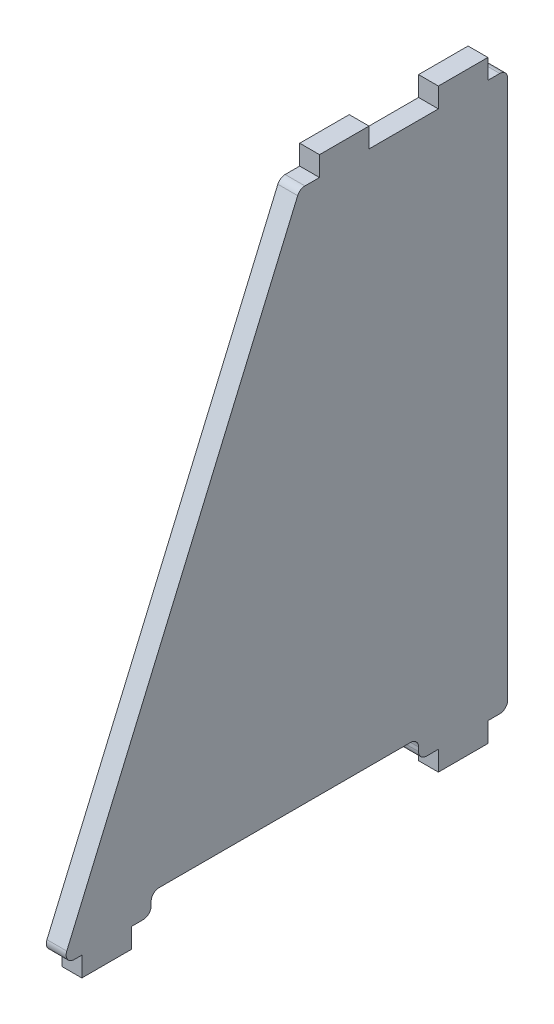
ISO-10303-21;
HEADER;
FILE_DESCRIPTION(('STEP AP214'),'2;1');
FILE_NAME('part.step','',(''),(''),'','','');
FILE_SCHEMA(('AUTOMOTIVE_DESIGN { 1 0 10303 214 1 1 1 1 }'));
ENDSEC;
DATA;
#1=APPLICATION_CONTEXT('core data for automotive mechanical design processes');
#2=APPLICATION_PROTOCOL_DEFINITION('international standard','automotive_design',2000,#1);
#3=PRODUCT_CONTEXT('',#1,'mechanical');
#4=PRODUCT('Part','Part','',(#3));
#5=PRODUCT_RELATED_PRODUCT_CATEGORY('part','',(#4));
#6=PRODUCT_DEFINITION_FORMATION('','',#4);
#7=PRODUCT_DEFINITION_CONTEXT('part definition',#1,'design');
#8=PRODUCT_DEFINITION('design','',#6,#7);
#9=PRODUCT_DEFINITION_SHAPE('','',#8);
#10=(LENGTH_UNIT() NAMED_UNIT(*) SI_UNIT(.MILLI.,.METRE.));
#11=(NAMED_UNIT(*) PLANE_ANGLE_UNIT() SI_UNIT($,.RADIAN.));
#12=(NAMED_UNIT(*) SI_UNIT($,.STERADIAN.) SOLID_ANGLE_UNIT());
#13=UNCERTAINTY_MEASURE_WITH_UNIT(LENGTH_MEASURE(1.E-05),#10,'distance_accuracy_value','');
#14=(GEOMETRIC_REPRESENTATION_CONTEXT(3) GLOBAL_UNCERTAINTY_ASSIGNED_CONTEXT((#13)) GLOBAL_UNIT_ASSIGNED_CONTEXT((#10,
#11,#12)) REPRESENTATION_CONTEXT('',''));
#15=CARTESIAN_POINT('',(0.,0.,0.));
#16=DIRECTION('',(0.,0.,1.));
#17=DIRECTION('',(1.,0.,0.));
#18=AXIS2_PLACEMENT_3D('',#15,#16,#17);
#19=CARTESIAN_POINT('',(6.35,0.,-4.76250000000001));
#20=DIRECTION('',(0.,0.,-1.));
#21=DIRECTION('',(0.,1.,0.));
#22=AXIS2_PLACEMENT_3D('',#19,#20,#21);
#23=PLANE('',#22);
#24=DIRECTION('',(0.,-1.,0.));
#25=VECTOR('',#24,1.);
#26=CARTESIAN_POINT('',(0.,0.,-4.76250000000001));
#27=LINE('',#26,#25);
#28=CARTESIAN_POINT('',(0.,-85.09,-4.76250000000002));
#29=VERTEX_POINT('',#28);
#30=CARTESIAN_POINT('',(0.,-86.36,-4.76250000000002));
#31=VERTEX_POINT('',#30);
#32=EDGE_CURVE('E420',#29,#31,#27,.T.);
#33=ORIENTED_EDGE('',*,*,#32,.T.);
#34=DIRECTION('',(-1.,0.,0.));
#35=VECTOR('',#34,1.);
#36=CARTESIAN_POINT('',(6.35,-86.36,-4.76250000000002));
#37=LINE('',#36,#35);
#38=CARTESIAN_POINT('',(6.35,-86.36,-4.76250000000002));
#39=VERTEX_POINT('',#38);
#40=EDGE_CURVE('E620',#31,#39,#37,.F.);
#41=ORIENTED_EDGE('',*,*,#40,.T.);
#42=DIRECTION('',(0.,-1.,0.));
#43=VECTOR('',#42,1.);
#44=CARTESIAN_POINT('',(6.35,0.,-4.76250000000001));
#45=LINE('',#44,#43);
#46=CARTESIAN_POINT('',(6.35,-85.09,-4.76250000000002));
#47=VERTEX_POINT('',#46);
#48=EDGE_CURVE('E344',#47,#39,#45,.T.);
#49=ORIENTED_EDGE('',*,*,#48,.F.);
#50=DIRECTION('',(-1.,0.,0.));
#51=VECTOR('',#50,1.);
#52=CARTESIAN_POINT('',(0.,-85.09,-4.76250000000002));
#53=LINE('',#52,#51);
#54=EDGE_CURVE('E616',#47,#29,#53,.T.);
#55=ORIENTED_EDGE('',*,*,#54,.T.);
#56=EDGE_LOOP('',(#33,#41,#49,#55));
#57=FACE_BOUND('',#56,.T.);
#58=ADVANCED_FACE('F121',(#57),#23,.F.);
#59=CARTESIAN_POINT('',(6.35,-88.9,0.));
#60=DIRECTION('',(0.,1.,0.));
#61=DIRECTION('',(0.,0.,1.));
#62=AXIS2_PLACEMENT_3D('',#59,#60,#61);
#63=PLANE('',#62);
#64=DIRECTION('',(0.,0.,-1.));
#65=VECTOR('',#64,1.);
#66=CARTESIAN_POINT('',(6.35,-88.9,0.));
#67=LINE('',#66,#65);
#68=CARTESIAN_POINT('',(6.35,-88.9,-7.30250000000002));
#69=VERTEX_POINT('',#68);
#70=CARTESIAN_POINT('',(6.35,-88.9,-11.1125));
#71=VERTEX_POINT('',#70);
#72=EDGE_CURVE('E330',#69,#71,#67,.T.);
#73=ORIENTED_EDGE('',*,*,#72,.F.);
#74=DIRECTION('',(-1.,0.,0.));
#75=VECTOR('',#74,1.);
#76=CARTESIAN_POINT('',(6.35,-88.9,-7.30250000000002));
#77=LINE('',#76,#75);
#78=CARTESIAN_POINT('',(0.,-88.9,-7.30250000000002));
#79=VERTEX_POINT('',#78);
#80=EDGE_CURVE('E613',#69,#79,#77,.T.);
#81=ORIENTED_EDGE('',*,*,#80,.T.);
#82=DIRECTION('',(0.,0.,-1.));
#83=VECTOR('',#82,1.);
#84=CARTESIAN_POINT('',(0.,-88.9,0.));
#85=LINE('',#84,#83);
#86=CARTESIAN_POINT('',(0.,-88.9,-11.1125));
#87=VERTEX_POINT('',#86);
#88=EDGE_CURVE('E351',#79,#87,#85,.T.);
#89=ORIENTED_EDGE('',*,*,#88,.T.);
#90=DIRECTION('',(-1.,0.,0.));
#91=VECTOR('',#90,1.);
#92=CARTESIAN_POINT('',(6.35,-88.9,-11.1125));
#93=LINE('',#92,#91);
#94=EDGE_CURVE('E348',#71,#87,#93,.T.);
#95=ORIENTED_EDGE('',*,*,#94,.F.);
#96=EDGE_LOOP('',(#73,#81,#89,#95));
#97=FACE_BOUND('',#96,.T.);
#98=ADVANCED_FACE('F349',(#97),#63,.F.);
#99=CARTESIAN_POINT('',(6.35,0.,-11.1125));
#100=DIRECTION('',(0.,0.,-1.));
#101=DIRECTION('',(0.,1.,0.));
#102=AXIS2_PLACEMENT_3D('',#99,#100,#101);
#103=PLANE('',#102);
#104=DIRECTION('',(0.,-1.,0.));
#105=VECTOR('',#104,1.);
#106=CARTESIAN_POINT('',(0.,0.,-11.1125));
#107=LINE('',#106,#105);
#108=CARTESIAN_POINT('',(0.,-95.25,-11.1125));
#109=VERTEX_POINT('',#108);
#110=EDGE_CURVE('E427',#87,#109,#107,.T.);
#111=ORIENTED_EDGE('',*,*,#110,.T.);
#112=DIRECTION('',(-1.,0.,0.));
#113=VECTOR('',#112,1.);
#114=CARTESIAN_POINT('',(6.35,-95.25,-11.1125));
#115=LINE('',#114,#113);
#116=CARTESIAN_POINT('',(6.35,-95.25,-11.1125));
#117=VERTEX_POINT('',#116);
#118=EDGE_CURVE('E356',#117,#109,#115,.T.);
#119=ORIENTED_EDGE('',*,*,#118,.F.);
#120=DIRECTION('',(0.,-1.,0.));
#121=VECTOR('',#120,1.);
#122=CARTESIAN_POINT('',(6.35,0.,-11.1125));
#123=LINE('',#122,#121);
#124=EDGE_CURVE('E335',#71,#117,#123,.T.);
#125=ORIENTED_EDGE('',*,*,#124,.F.);
#126=ORIENTED_EDGE('',*,*,#94,.T.);
#127=EDGE_LOOP('',(#111,#119,#125,#126));
#128=FACE_BOUND('',#127,.T.);
#129=ADVANCED_FACE('F358',(#128),#103,.F.);
#130=CARTESIAN_POINT('',(6.35,-95.25,0.));
#131=DIRECTION('',(0.,1.,0.));
#132=DIRECTION('',(0.,0.,1.));
#133=AXIS2_PLACEMENT_3D('',#130,#131,#132);
#134=PLANE('',#133);
#135=DIRECTION('',(0.,0.,-1.));
#136=VECTOR('',#135,1.);
#137=CARTESIAN_POINT('',(0.,-95.25,0.));
#138=LINE('',#137,#136);
#139=CARTESIAN_POINT('',(0.,-95.25,-26.9875));
#140=VERTEX_POINT('',#139);
#141=EDGE_CURVE('E431',#109,#140,#138,.T.);
#142=ORIENTED_EDGE('',*,*,#141,.T.);
#143=DIRECTION('',(-1.,0.,0.));
#144=VECTOR('',#143,1.);
#145=CARTESIAN_POINT('',(6.35,-95.25,-26.9875));
#146=LINE('',#145,#144);
#147=CARTESIAN_POINT('',(6.35,-95.25,-26.9875));
#148=VERTEX_POINT('',#147);
#149=EDGE_CURVE('E513',#148,#140,#146,.T.);
#150=ORIENTED_EDGE('',*,*,#149,.F.);
#151=DIRECTION('',(0.,0.,-1.));
#152=VECTOR('',#151,1.);
#153=CARTESIAN_POINT('',(6.35,-95.25,0.));
#154=LINE('',#153,#152);
#155=EDGE_CURVE('E362',#117,#148,#154,.T.);
#156=ORIENTED_EDGE('',*,*,#155,.F.);
#157=ORIENTED_EDGE('',*,*,#118,.T.);
#158=EDGE_LOOP('',(#142,#150,#156,#157));
#159=FACE_BOUND('',#158,.T.);
#160=ADVANCED_FACE('F672',(#159),#134,.F.);
#161=CARTESIAN_POINT('',(6.35,0.,-26.9875));
#162=DIRECTION('',(0.,0.,-1.));
#163=DIRECTION('',(0.,1.,0.));
#164=AXIS2_PLACEMENT_3D('',#161,#162,#163);
#165=PLANE('',#164);
#166=DIRECTION('',(0.,-1.,0.));
#167=VECTOR('',#166,1.);
#168=CARTESIAN_POINT('',(0.,0.,-26.9875));
#169=LINE('',#168,#167);
#170=CARTESIAN_POINT('',(0.,-88.9,-26.9875));
#171=VERTEX_POINT('',#170);
#172=EDGE_CURVE('E435',#171,#140,#169,.T.);
#173=ORIENTED_EDGE('',*,*,#172,.F.);
#174=DIRECTION('',(-1.,0.,0.));
#175=VECTOR('',#174,1.);
#176=CARTESIAN_POINT('',(6.35,-88.9,-26.9875));
#177=LINE('',#176,#175);
#178=CARTESIAN_POINT('',(6.35,-88.9,-26.9875));
#179=VERTEX_POINT('',#178);
#180=EDGE_CURVE('E510',#179,#171,#177,.T.);
#181=ORIENTED_EDGE('',*,*,#180,.F.);
#182=DIRECTION('',(0.,-1.,0.));
#183=VECTOR('',#182,1.);
#184=CARTESIAN_POINT('',(6.35,0.,-26.9875));
#185=LINE('',#184,#183);
#186=EDGE_CURVE('E365',#179,#148,#185,.T.);
#187=ORIENTED_EDGE('',*,*,#186,.T.);
#188=ORIENTED_EDGE('',*,*,#149,.T.);
#189=EDGE_LOOP('',(#173,#181,#187,#188));
#190=FACE_BOUND('',#189,.T.);
#191=ADVANCED_FACE('F680',(#190),#165,.T.);
#192=CARTESIAN_POINT('',(0.,-88.9,-30.7975));
#193=VERTEX_POINT('',#192);
#194=EDGE_CURVE('E428',#171,#193,#85,.T.);
#195=ORIENTED_EDGE('',*,*,#194,.T.);
#196=DIRECTION('',(-1.,0.,0.));
#197=VECTOR('',#196,1.);
#198=CARTESIAN_POINT('',(6.35,-88.9,-30.7975));
#199=LINE('',#198,#197);
#200=CARTESIAN_POINT('',(6.35,-88.9,-30.7975));
#201=VERTEX_POINT('',#200);
#202=EDGE_CURVE('E606',#193,#201,#199,.F.);
#203=ORIENTED_EDGE('',*,*,#202,.T.);
#204=EDGE_CURVE('E346',#179,#201,#67,.T.);
#205=ORIENTED_EDGE('',*,*,#204,.F.);
#206=ORIENTED_EDGE('',*,*,#180,.T.);
#207=EDGE_LOOP('',(#195,#203,#205,#206));
#208=FACE_BOUND('',#207,.T.);
#209=ADVANCED_FACE('F684',(#208),#63,.F.);
#210=CARTESIAN_POINT('',(6.35,0.,-33.3375));
#211=DIRECTION('',(0.,0.,-1.));
#212=DIRECTION('',(0.,1.,0.));
#213=AXIS2_PLACEMENT_3D('',#210,#211,#212);
#214=PLANE('',#213);
#215=DIRECTION('',(0.,-1.,0.));
#216=VECTOR('',#215,1.);
#217=CARTESIAN_POINT('',(0.,0.,-33.3375));
#218=LINE('',#217,#216);
#219=CARTESIAN_POINT('',(0.,86.36,-33.3375));
#220=VERTEX_POINT('',#219);
#221=CARTESIAN_POINT('',(0.,-86.36,-33.3375));
#222=VERTEX_POINT('',#221);
#223=EDGE_CURVE('E439',#220,#222,#218,.T.);
#224=ORIENTED_EDGE('',*,*,#223,.F.);
#225=DIRECTION('',(-1.,0.,0.));
#226=VECTOR('',#225,1.);
#227=CARTESIAN_POINT('',(6.35,86.36,-33.3375));
#228=LINE('',#227,#226);
#229=CARTESIAN_POINT('',(6.35,86.36,-33.3375));
#230=VERTEX_POINT('',#229);
#231=EDGE_CURVE('E603',#220,#230,#228,.F.);
#232=ORIENTED_EDGE('',*,*,#231,.T.);
#233=DIRECTION('',(0.,-1.,0.));
#234=VECTOR('',#233,1.);
#235=CARTESIAN_POINT('',(6.35,0.,-33.3375));
#236=LINE('',#235,#234);
#237=CARTESIAN_POINT('',(6.35,-86.36,-33.3375));
#238=VERTEX_POINT('',#237);
#239=EDGE_CURVE('E372',#230,#238,#236,.T.);
#240=ORIENTED_EDGE('',*,*,#239,.T.);
#241=DIRECTION('',(-1.,0.,0.));
#242=VECTOR('',#241,1.);
#243=CARTESIAN_POINT('',(0.,-86.36,-33.3375));
#244=LINE('',#243,#242);
#245=EDGE_CURVE('E599',#238,#222,#244,.T.);
#246=ORIENTED_EDGE('',*,*,#245,.T.);
#247=EDGE_LOOP('',(#224,#232,#240,#246));
#248=FACE_BOUND('',#247,.T.);
#249=ADVANCED_FACE('F750',(#248),#214,.T.);
#250=CARTESIAN_POINT('',(6.35,88.9,0.));
#251=DIRECTION('',(0.,1.,0.));
#252=DIRECTION('',(0.,0.,1.));
#253=AXIS2_PLACEMENT_3D('',#250,#251,#252);
#254=PLANE('',#253);
#255=DIRECTION('',(0.,0.,-1.));
#256=VECTOR('',#255,1.);
#257=CARTESIAN_POINT('',(6.35,88.9,0.));
#258=LINE('',#257,#256);
#259=CARTESIAN_POINT('',(6.35,88.9,-26.9875));
#260=VERTEX_POINT('',#259);
#261=CARTESIAN_POINT('',(6.35,88.9,-30.7975));
#262=VERTEX_POINT('',#261);
#263=EDGE_CURVE('E376',#260,#262,#258,.T.);
#264=ORIENTED_EDGE('',*,*,#263,.T.);
#265=DIRECTION('',(-1.,0.,0.));
#266=VECTOR('',#265,1.);
#267=CARTESIAN_POINT('',(6.35,88.9,-30.7975));
#268=LINE('',#267,#266);
#269=CARTESIAN_POINT('',(0.,88.9,-30.7975));
#270=VERTEX_POINT('',#269);
#271=EDGE_CURVE('E595',#262,#270,#268,.T.);
#272=ORIENTED_EDGE('',*,*,#271,.T.);
#273=DIRECTION('',(0.,0.,-1.));
#274=VECTOR('',#273,1.);
#275=CARTESIAN_POINT('',(0.,88.9,0.));
#276=LINE('',#275,#274);
#277=CARTESIAN_POINT('',(0.,88.9,-26.9875));
#278=VERTEX_POINT('',#277);
#279=EDGE_CURVE('E443',#278,#270,#276,.T.);
#280=ORIENTED_EDGE('',*,*,#279,.F.);
#281=DIRECTION('',(-1.,0.,0.));
#282=VECTOR('',#281,1.);
#283=CARTESIAN_POINT('',(6.35,88.9,-26.9875));
#284=LINE('',#283,#282);
#285=EDGE_CURVE('E507',#260,#278,#284,.T.);
#286=ORIENTED_EDGE('',*,*,#285,.F.);
#287=EDGE_LOOP('',(#264,#272,#280,#286));
#288=FACE_BOUND('',#287,.T.);
#289=ADVANCED_FACE('F740',(#288),#254,.T.);
#290=CARTESIAN_POINT('',(6.35,0.,-26.9875));
#291=DIRECTION('',(0.,0.,1.));
#292=DIRECTION('',(0.,-1.,0.));
#293=AXIS2_PLACEMENT_3D('',#290,#291,#292);
#294=PLANE('',#293);
#295=DIRECTION('',(0.,1.,0.));
#296=VECTOR('',#295,1.);
#297=CARTESIAN_POINT('',(0.,0.,-26.9875));
#298=LINE('',#297,#296);
#299=CARTESIAN_POINT('',(0.,95.25,-26.9875));
#300=VERTEX_POINT('',#299);
#301=EDGE_CURVE('E447',#278,#300,#298,.T.);
#302=ORIENTED_EDGE('',*,*,#301,.T.);
#303=DIRECTION('',(-1.,0.,0.));
#304=VECTOR('',#303,1.);
#305=CARTESIAN_POINT('',(6.35,95.25,-26.9875));
#306=LINE('',#305,#304);
#307=CARTESIAN_POINT('',(6.35,95.25,-26.9875));
#308=VERTEX_POINT('',#307);
#309=EDGE_CURVE('E504',#308,#300,#306,.T.);
#310=ORIENTED_EDGE('',*,*,#309,.F.);
#311=DIRECTION('',(0.,1.,0.));
#312=VECTOR('',#311,1.);
#313=CARTESIAN_POINT('',(6.35,0.,-26.9875));
#314=LINE('',#313,#312);
#315=EDGE_CURVE('E380',#260,#308,#314,.T.);
#316=ORIENTED_EDGE('',*,*,#315,.F.);
#317=ORIENTED_EDGE('',*,*,#285,.T.);
#318=EDGE_LOOP('',(#302,#310,#316,#317));
#319=FACE_BOUND('',#318,.T.);
#320=ADVANCED_FACE('F756',(#319),#294,.F.);
#321=CARTESIAN_POINT('',(6.35,95.25,0.));
#322=DIRECTION('',(0.,1.,0.));
#323=DIRECTION('',(0.,0.,1.));
#324=AXIS2_PLACEMENT_3D('',#321,#322,#323);
#325=PLANE('',#324);
#326=DIRECTION('',(0.,0.,-1.));
#327=VECTOR('',#326,1.);
#328=CARTESIAN_POINT('',(0.,95.25,0.));
#329=LINE('',#328,#327);
#330=CARTESIAN_POINT('',(0.,95.25,-11.1125));
#331=VERTEX_POINT('',#330);
#332=EDGE_CURVE('E453',#331,#300,#329,.T.);
#333=ORIENTED_EDGE('',*,*,#332,.F.);
#334=DIRECTION('',(-1.,0.,0.));
#335=VECTOR('',#334,1.);
#336=CARTESIAN_POINT('',(6.35,95.25,-11.1125));
#337=LINE('',#336,#335);
#338=CARTESIAN_POINT('',(6.35,95.25,-11.1125));
#339=VERTEX_POINT('',#338);
#340=EDGE_CURVE('E501',#339,#331,#337,.T.);
#341=ORIENTED_EDGE('',*,*,#340,.F.);
#342=DIRECTION('',(0.,0.,-1.));
#343=VECTOR('',#342,1.);
#344=CARTESIAN_POINT('',(6.35,95.25,0.));
#345=LINE('',#344,#343);
#346=EDGE_CURVE('E385',#339,#308,#345,.T.);
#347=ORIENTED_EDGE('',*,*,#346,.T.);
#348=ORIENTED_EDGE('',*,*,#309,.T.);
#349=EDGE_LOOP('',(#333,#341,#347,#348));
#350=FACE_BOUND('',#349,.T.);
#351=ADVANCED_FACE('F734',(#350),#325,.T.);
#352=CARTESIAN_POINT('',(6.35,0.,-11.1125));
#353=DIRECTION('',(0.,0.,1.));
#354=DIRECTION('',(0.,-1.,0.));
#355=AXIS2_PLACEMENT_3D('',#352,#353,#354);
#356=PLANE('',#355);
#357=DIRECTION('',(0.,1.,0.));
#358=VECTOR('',#357,1.);
#359=CARTESIAN_POINT('',(0.,0.,-11.1125));
#360=LINE('',#359,#358);
#361=CARTESIAN_POINT('',(0.,88.9,-11.1125));
#362=VERTEX_POINT('',#361);
#363=EDGE_CURVE('E457',#362,#331,#360,.T.);
#364=ORIENTED_EDGE('',*,*,#363,.F.);
#365=DIRECTION('',(-1.,0.,0.));
#366=VECTOR('',#365,1.);
#367=CARTESIAN_POINT('',(6.35,88.9,-11.1125));
#368=LINE('',#367,#366);
#369=CARTESIAN_POINT('',(6.35,88.9,-11.1125));
#370=VERTEX_POINT('',#369);
#371=EDGE_CURVE('E498',#370,#362,#368,.T.);
#372=ORIENTED_EDGE('',*,*,#371,.F.);
#373=DIRECTION('',(0.,1.,0.));
#374=VECTOR('',#373,1.);
#375=CARTESIAN_POINT('',(6.35,0.,-11.1125));
#376=LINE('',#375,#374);
#377=EDGE_CURVE('E389',#370,#339,#376,.T.);
#378=ORIENTED_EDGE('',*,*,#377,.T.);
#379=ORIENTED_EDGE('',*,*,#340,.T.);
#380=EDGE_LOOP('',(#364,#372,#378,#379));
#381=FACE_BOUND('',#380,.T.);
#382=ADVANCED_FACE('F730',(#381),#356,.T.);
#383=CARTESIAN_POINT('',(0.,88.9,11.1125));
#384=VERTEX_POINT('',#383);
#385=EDGE_CURVE('E449',#384,#362,#276,.T.);
#386=ORIENTED_EDGE('',*,*,#385,.F.);
#387=DIRECTION('',(-1.,0.,0.));
#388=VECTOR('',#387,1.);
#389=CARTESIAN_POINT('',(6.35,88.9,11.1125));
#390=LINE('',#389,#388);
#391=CARTESIAN_POINT('',(6.35,88.9,11.1125));
#392=VERTEX_POINT('',#391);
#393=EDGE_CURVE('E495',#392,#384,#390,.T.);
#394=ORIENTED_EDGE('',*,*,#393,.F.);
#395=EDGE_CURVE('E382',#392,#370,#258,.T.);
#396=ORIENTED_EDGE('',*,*,#395,.T.);
#397=ORIENTED_EDGE('',*,*,#371,.T.);
#398=EDGE_LOOP('',(#386,#394,#396,#397));
#399=FACE_BOUND('',#398,.T.);
#400=ADVANCED_FACE('F725',(#399),#254,.T.);
#401=CARTESIAN_POINT('',(6.35,0.,11.1125));
#402=DIRECTION('',(0.,0.,1.));
#403=DIRECTION('',(1.,0.,0.));
#404=AXIS2_PLACEMENT_3D('',#401,#402,#403);
#405=PLANE('',#404);
#406=DIRECTION('',(0.,1.,0.));
#407=VECTOR('',#406,1.);
#408=CARTESIAN_POINT('',(0.,0.,11.1125));
#409=LINE('',#408,#407);
#410=CARTESIAN_POINT('',(0.,95.2499999999999,11.1125));
#411=VERTEX_POINT('',#410);
#412=EDGE_CURVE('E461',#384,#411,#409,.T.);
#413=ORIENTED_EDGE('',*,*,#412,.T.);
#414=DIRECTION('',(-1.,0.,0.));
#415=VECTOR('',#414,1.);
#416=CARTESIAN_POINT('',(6.35,95.2499999999999,11.1125));
#417=LINE('',#416,#415);
#418=CARTESIAN_POINT('',(6.35,95.2499999999999,11.1125));
#419=VERTEX_POINT('',#418);
#420=EDGE_CURVE('E492',#419,#411,#417,.T.);
#421=ORIENTED_EDGE('',*,*,#420,.F.);
#422=DIRECTION('',(0.,1.,0.));
#423=VECTOR('',#422,1.);
#424=CARTESIAN_POINT('',(6.35,0.,11.1125));
#425=LINE('',#424,#423);
#426=EDGE_CURVE('E393',#392,#419,#425,.T.);
#427=ORIENTED_EDGE('',*,*,#426,.F.);
#428=ORIENTED_EDGE('',*,*,#393,.T.);
#429=EDGE_LOOP('',(#413,#421,#427,#428));
#430=FACE_BOUND('',#429,.T.);
#431=ADVANCED_FACE('F841',(#430),#405,.F.);
#432=CARTESIAN_POINT('',(6.35,95.2499999999999,-1.66533453693773E-13));
#433=DIRECTION('',(0.,1.,0.));
#434=DIRECTION('',(0.,0.,1.));
#435=AXIS2_PLACEMENT_3D('',#432,#433,#434);
#436=PLANE('',#435);
#437=DIRECTION('',(0.,0.,-1.));
#438=VECTOR('',#437,1.);
#439=CARTESIAN_POINT('',(0.,95.2499999999999,-1.66533453693773E-13));
#440=LINE('',#439,#438);
#441=CARTESIAN_POINT('',(0.,95.25,26.9875));
#442=VERTEX_POINT('',#441);
#443=EDGE_CURVE('E465',#442,#411,#440,.T.);
#444=ORIENTED_EDGE('',*,*,#443,.F.);
#445=DIRECTION('',(-1.,0.,0.));
#446=VECTOR('',#445,1.);
#447=CARTESIAN_POINT('',(6.35,95.25,26.9875));
#448=LINE('',#447,#446);
#449=CARTESIAN_POINT('',(6.35,95.25,26.9875));
#450=VERTEX_POINT('',#449);
#451=EDGE_CURVE('E489',#450,#442,#448,.T.);
#452=ORIENTED_EDGE('',*,*,#451,.F.);
#453=DIRECTION('',(0.,0.,-1.));
#454=VECTOR('',#453,1.);
#455=CARTESIAN_POINT('',(6.35,95.2499999999999,-1.66533453693773E-13));
#456=LINE('',#455,#454);
#457=EDGE_CURVE('E396',#450,#419,#456,.T.);
#458=ORIENTED_EDGE('',*,*,#457,.T.);
#459=ORIENTED_EDGE('',*,*,#420,.T.);
#460=EDGE_LOOP('',(#444,#452,#458,#459));
#461=FACE_BOUND('',#460,.T.);
#462=ADVANCED_FACE('F837',(#461),#436,.T.);
#463=CARTESIAN_POINT('',(6.35,0.,26.9875));
#464=DIRECTION('',(0.,0.,1.));
#465=DIRECTION('',(1.,0.,0.));
#466=AXIS2_PLACEMENT_3D('',#463,#464,#465);
#467=PLANE('',#466);
#468=DIRECTION('',(0.,1.,0.));
#469=VECTOR('',#468,1.);
#470=CARTESIAN_POINT('',(0.,0.,26.9875));
#471=LINE('',#470,#469);
#472=CARTESIAN_POINT('',(0.,88.9,26.9875));
#473=VERTEX_POINT('',#472);
#474=EDGE_CURVE('E469',#473,#442,#471,.T.);
#475=ORIENTED_EDGE('',*,*,#474,.F.);
#476=DIRECTION('',(-1.,0.,0.));
#477=VECTOR('',#476,1.);
#478=CARTESIAN_POINT('',(6.35,88.9,26.9875));
#479=LINE('',#478,#477);
#480=CARTESIAN_POINT('',(6.35,88.9,26.9875));
#481=VERTEX_POINT('',#480);
#482=EDGE_CURVE('E415',#481,#473,#479,.T.);
#483=ORIENTED_EDGE('',*,*,#482,.F.);
#484=DIRECTION('',(0.,1.,0.));
#485=VECTOR('',#484,1.);
#486=CARTESIAN_POINT('',(6.35,0.,26.9875));
#487=LINE('',#486,#485);
#488=EDGE_CURVE('E400',#481,#450,#487,.T.);
#489=ORIENTED_EDGE('',*,*,#488,.T.);
#490=ORIENTED_EDGE('',*,*,#451,.T.);
#491=EDGE_LOOP('',(#475,#483,#489,#490));
#492=FACE_BOUND('',#491,.T.);
#493=ADVANCED_FACE('F834',(#492),#467,.T.);
#494=CARTESIAN_POINT('',(0.,88.9,31.6626337587294));
#495=VERTEX_POINT('',#494);
#496=EDGE_CURVE('E448',#495,#473,#276,.T.);
#497=ORIENTED_EDGE('',*,*,#496,.F.);
#498=DIRECTION('',(-1.,0.,0.));
#499=VECTOR('',#498,1.);
#500=CARTESIAN_POINT('',(6.35,88.9,31.6626337587294));
#501=LINE('',#500,#499);
#502=CARTESIAN_POINT('',(6.35,88.9,31.6626337587294));
#503=VERTEX_POINT('',#502);
#504=EDGE_CURVE('E576',#495,#503,#501,.F.);
#505=ORIENTED_EDGE('',*,*,#504,.T.);
#506=EDGE_CURVE('E381',#503,#481,#258,.T.);
#507=ORIENTED_EDGE('',*,*,#506,.T.);
#508=ORIENTED_EDGE('',*,*,#482,.T.);
#509=EDGE_LOOP('',(#497,#505,#507,#508));
#510=FACE_BOUND('',#509,.T.);
#511=ADVANCED_FACE('F715',(#510),#254,.T.);
#512=CARTESIAN_POINT('',(6.35,25.8653017241379,60.3523706896551));
#513=DIRECTION('',(0.,0.393919298579168,0.919145030018058));
#514=DIRECTION('',(0.,-0.919145030018058,0.393919298579168));
#515=AXIS2_PLACEMENT_3D('',#512,#513,#514);
#516=PLANE('',#515);
#517=DIRECTION('',(0.,0.919145030018058,-0.393919298579168));
#518=VECTOR('',#517,1.);
#519=CARTESIAN_POINT('',(6.35,25.8653017241379,60.3523706896551));
#520=LINE('',#519,#518);
#521=CARTESIAN_POINT('',(6.35,-85.359444981609,108.020119277832));
#522=VERTEX_POINT('',#521);
#523=CARTESIAN_POINT('',(6.35,87.3605550183911,33.9972621349752));
#524=VERTEX_POINT('',#523);
#525=EDGE_CURVE('E404',#522,#524,#520,.T.);
#526=ORIENTED_EDGE('',*,*,#525,.T.);
#527=DIRECTION('',(-1.,0.,0.));
#528=VECTOR('',#527,1.);
#529=CARTESIAN_POINT('',(6.35,87.3605550183911,33.9972621349752));
#530=LINE('',#529,#528);
#531=CARTESIAN_POINT('',(0.,87.3605550183911,33.9972621349752));
#532=VERTEX_POINT('',#531);
#533=EDGE_CURVE('E554',#524,#532,#530,.T.);
#534=ORIENTED_EDGE('',*,*,#533,.T.);
#535=DIRECTION('',(0.,0.919145030018058,-0.393919298579168));
#536=VECTOR('',#535,1.);
#537=CARTESIAN_POINT('',(0.,25.8653017241379,60.3523706896551));
#538=LINE('',#537,#536);
#539=CARTESIAN_POINT('',(0.,-85.359444981609,108.020119277832));
#540=VERTEX_POINT('',#539);
#541=EDGE_CURVE('E473',#540,#532,#538,.T.);
#542=ORIENTED_EDGE('',*,*,#541,.F.);
#543=DIRECTION('',(-1.,0.,0.));
#544=VECTOR('',#543,1.);
#545=CARTESIAN_POINT('',(6.35,-85.3594449816089,108.020119277832));
#546=LINE('',#545,#544);
#547=EDGE_CURVE('E524',#540,#522,#546,.F.);
#548=ORIENTED_EDGE('',*,*,#547,.T.);
#549=EDGE_LOOP('',(#526,#534,#542,#548));
#550=FACE_BOUND('',#549,.T.);
#551=ADVANCED_FACE('F706',(#550),#516,.T.);
#552=CARTESIAN_POINT('',(6.35,-88.9,0.));
#553=DIRECTION('',(0.,-1.,0.));
#554=DIRECTION('',(0.,0.,-1.));
#555=AXIS2_PLACEMENT_3D('',#552,#553,#554);
#556=PLANE('',#555);
#557=DIRECTION('',(0.,0.,1.));
#558=VECTOR('',#557,1.);
#559=CARTESIAN_POINT('',(6.35,-88.9,0.));
#560=LINE('',#559,#558);
#561=CARTESIAN_POINT('',(6.35,-88.9,103.1875));
#562=VERTEX_POINT('',#561);
#563=CARTESIAN_POINT('',(6.35,-88.9,105.685490901587));
#564=VERTEX_POINT('',#563);
#565=EDGE_CURVE('E408',#562,#564,#560,.T.);
#566=ORIENTED_EDGE('',*,*,#565,.T.);
#567=DIRECTION('',(-1.,0.,0.));
#568=VECTOR('',#567,1.);
#569=CARTESIAN_POINT('',(6.35,-88.9,105.685490901587));
#570=LINE('',#569,#568);
#571=CARTESIAN_POINT('',(0.,-88.9,105.685490901587));
#572=VERTEX_POINT('',#571);
#573=EDGE_CURVE('E609',#564,#572,#570,.T.);
#574=ORIENTED_EDGE('',*,*,#573,.T.);
#575=DIRECTION('',(0.,0.,1.));
#576=VECTOR('',#575,1.);
#577=CARTESIAN_POINT('',(0.,-88.9,0.));
#578=LINE('',#577,#576);
#579=CARTESIAN_POINT('',(0.,-88.9,103.1875));
#580=VERTEX_POINT('',#579);
#581=EDGE_CURVE('E477',#580,#572,#578,.T.);
#582=ORIENTED_EDGE('',*,*,#581,.F.);
#583=DIRECTION('',(1.,0.,0.));
#584=VECTOR('',#583,1.);
#585=CARTESIAN_POINT('',(6.35,-88.9,103.1875));
#586=LINE('',#585,#584);
#587=EDGE_CURVE('E355',#580,#562,#586,.T.);
#588=ORIENTED_EDGE('',*,*,#587,.T.);
#589=EDGE_LOOP('',(#566,#574,#582,#588));
#590=FACE_BOUND('',#589,.T.);
#591=ADVANCED_FACE('F695',(#590),#556,.T.);
#592=CARTESIAN_POINT('',(0.,-88.9,83.5025));
#593=VERTEX_POINT('',#592);
#594=CARTESIAN_POINT('',(0.,-88.9,87.3125));
#595=VERTEX_POINT('',#594);
#596=EDGE_CURVE('E478',#593,#595,#578,.T.);
#597=ORIENTED_EDGE('',*,*,#596,.F.);
#598=DIRECTION('',(-1.,0.,0.));
#599=VECTOR('',#598,1.);
#600=CARTESIAN_POINT('',(6.35,-88.9,83.5025));
#601=LINE('',#600,#599);
#602=CARTESIAN_POINT('',(6.35,-88.9,83.5025));
#603=VERTEX_POINT('',#602);
#604=EDGE_CURVE('E636',#593,#603,#601,.F.);
#605=ORIENTED_EDGE('',*,*,#604,.T.);
#606=CARTESIAN_POINT('',(6.35,-88.9,87.3125));
#607=VERTEX_POINT('',#606);
#608=EDGE_CURVE('E409',#603,#607,#560,.T.);
#609=ORIENTED_EDGE('',*,*,#608,.T.);
#610=DIRECTION('',(1.,0.,0.));
#611=VECTOR('',#610,1.);
#612=CARTESIAN_POINT('',(6.35,-88.9,87.3125));
#613=LINE('',#612,#611);
#614=EDGE_CURVE('E520',#595,#607,#613,.T.);
#615=ORIENTED_EDGE('',*,*,#614,.F.);
#616=EDGE_LOOP('',(#597,#605,#609,#615));
#617=FACE_BOUND('',#616,.T.);
#618=ADVANCED_FACE('F814',(#617),#556,.T.);
#619=CARTESIAN_POINT('',(6.35,0.,80.9625));
#620=DIRECTION('',(0.,0.,-1.));
#621=DIRECTION('',(-1.,0.,0.));
#622=AXIS2_PLACEMENT_3D('',#619,#620,#621);
#623=PLANE('',#622);
#624=DIRECTION('',(0.,-1.,0.));
#625=VECTOR('',#624,1.);
#626=CARTESIAN_POINT('',(0.,0.,80.9625));
#627=LINE('',#626,#625);
#628=CARTESIAN_POINT('',(0.,-85.09,80.9625));
#629=VERTEX_POINT('',#628);
#630=CARTESIAN_POINT('',(0.,-86.36,80.9625));
#631=VERTEX_POINT('',#630);
#632=EDGE_CURVE('E481',#629,#631,#627,.T.);
#633=ORIENTED_EDGE('',*,*,#632,.F.);
#634=DIRECTION('',(-1.,0.,0.));
#635=VECTOR('',#634,1.);
#636=CARTESIAN_POINT('',(6.35,-85.09,80.9625));
#637=LINE('',#636,#635);
#638=CARTESIAN_POINT('',(6.35,-85.09,80.9625));
#639=VERTEX_POINT('',#638);
#640=EDGE_CURVE('E144',#629,#639,#637,.F.);
#641=ORIENTED_EDGE('',*,*,#640,.T.);
#642=DIRECTION('',(0.,-1.,0.));
#643=VECTOR('',#642,1.);
#644=CARTESIAN_POINT('',(6.35,0.,80.9625));
#645=LINE('',#644,#643);
#646=CARTESIAN_POINT('',(6.35,-86.36,80.9625));
#647=VERTEX_POINT('',#646);
#648=EDGE_CURVE('E412',#639,#647,#645,.T.);
#649=ORIENTED_EDGE('',*,*,#648,.T.);
#650=DIRECTION('',(-1.,0.,0.));
#651=VECTOR('',#650,1.);
#652=CARTESIAN_POINT('',(6.35,-86.36,80.9625));
#653=LINE('',#652,#651);
#654=EDGE_CURVE('E630',#647,#631,#653,.T.);
#655=ORIENTED_EDGE('',*,*,#654,.T.);
#656=EDGE_LOOP('',(#633,#641,#649,#655));
#657=FACE_BOUND('',#656,.T.);
#658=ADVANCED_FACE('F650',(#657),#623,.T.);
#659=CARTESIAN_POINT('',(6.35,-82.55,0.));
#660=DIRECTION('',(0.,1.,0.));
#661=DIRECTION('',(0.,0.,1.));
#662=AXIS2_PLACEMENT_3D('',#659,#660,#661);
#663=PLANE('',#662);
#664=DIRECTION('',(0.,0.,-1.));
#665=VECTOR('',#664,1.);
#666=CARTESIAN_POINT('',(0.,-82.55,0.));
#667=LINE('',#666,#665);
#668=CARTESIAN_POINT('',(0.,-82.55,78.4225));
#669=VERTEX_POINT('',#668);
#670=CARTESIAN_POINT('',(0.,-82.55,-2.22250000000002));
#671=VERTEX_POINT('',#670);
#672=EDGE_CURVE('E416',#669,#671,#667,.T.);
#673=ORIENTED_EDGE('',*,*,#672,.T.);
#674=DIRECTION('',(-1.,0.,0.));
#675=VECTOR('',#674,1.);
#676=CARTESIAN_POINT('',(6.35,-82.55,-2.22250000000002));
#677=LINE('',#676,#675);
#678=CARTESIAN_POINT('',(6.35,-82.55,-2.22250000000002));
#679=VERTEX_POINT('',#678);
#680=EDGE_CURVE('E627',#671,#679,#677,.F.);
#681=ORIENTED_EDGE('',*,*,#680,.T.);
#682=DIRECTION('',(0.,0.,-1.));
#683=VECTOR('',#682,1.);
#684=CARTESIAN_POINT('',(6.35,-82.55,0.));
#685=LINE('',#684,#683);
#686=CARTESIAN_POINT('',(6.35,-82.55,78.4225));
#687=VERTEX_POINT('',#686);
#688=EDGE_CURVE('E485',#687,#679,#685,.T.);
#689=ORIENTED_EDGE('',*,*,#688,.F.);
#690=DIRECTION('',(-1.,0.,0.));
#691=VECTOR('',#690,1.);
#692=CARTESIAN_POINT('',(6.35,-82.55,78.4225));
#693=LINE('',#692,#691);
#694=EDGE_CURVE('E623',#687,#669,#693,.T.);
#695=ORIENTED_EDGE('',*,*,#694,.T.);
#696=EDGE_LOOP('',(#673,#681,#689,#695));
#697=FACE_BOUND('',#696,.T.);
#698=ADVANCED_FACE('F658',(#697),#663,.F.);
#699=CARTESIAN_POINT('',(0.,0.,0.));
#700=DIRECTION('',(1.,0.,0.));
#701=DIRECTION('',(0.,0.,-1.));
#702=AXIS2_PLACEMENT_3D('',#699,#700,#701);
#703=PLANE('',#702);
#704=ORIENTED_EDGE('',*,*,#541,.T.);
#705=CARTESIAN_POINT('',(0.,86.36,31.6626337587294));
#706=DIRECTION('',(1.,0.,0.));
#707=DIRECTION('',(0.,0.,-1.));
#708=AXIS2_PLACEMENT_3D('',#705,#706,#707);
#709=CIRCLE('',#708,2.54);
#710=EDGE_CURVE('E573',#532,#495,#709,.F.);
#711=ORIENTED_EDGE('',*,*,#710,.T.);
#712=ORIENTED_EDGE('',*,*,#496,.T.);
#713=ORIENTED_EDGE('',*,*,#474,.T.);
#714=ORIENTED_EDGE('',*,*,#443,.T.);
#715=ORIENTED_EDGE('',*,*,#412,.F.);
#716=ORIENTED_EDGE('',*,*,#385,.T.);
#717=ORIENTED_EDGE('',*,*,#363,.T.);
#718=ORIENTED_EDGE('',*,*,#332,.T.);
#719=ORIENTED_EDGE('',*,*,#301,.F.);
#720=ORIENTED_EDGE('',*,*,#279,.T.);
#721=CARTESIAN_POINT('',(0.,86.36,-30.7975));
#722=DIRECTION('',(1.,0.,0.));
#723=DIRECTION('',(0.,0.,-1.));
#724=AXIS2_PLACEMENT_3D('',#721,#722,#723);
#725=CIRCLE('',#724,2.54);
#726=EDGE_CURVE('E570',#270,#220,#725,.F.);
#727=ORIENTED_EDGE('',*,*,#726,.T.);
#728=ORIENTED_EDGE('',*,*,#223,.T.);
#729=CARTESIAN_POINT('',(0.,-86.36,-30.7975));
#730=DIRECTION('',(1.,0.,0.));
#731=DIRECTION('',(0.,0.,-1.));
#732=AXIS2_PLACEMENT_3D('',#729,#730,#731);
#733=CIRCLE('',#732,2.54);
#734=EDGE_CURVE('E567',#222,#193,#733,.F.);
#735=ORIENTED_EDGE('',*,*,#734,.T.);
#736=ORIENTED_EDGE('',*,*,#194,.F.);
#737=ORIENTED_EDGE('',*,*,#172,.T.);
#738=ORIENTED_EDGE('',*,*,#141,.F.);
#739=ORIENTED_EDGE('',*,*,#110,.F.);
#740=ORIENTED_EDGE('',*,*,#88,.F.);
#741=CARTESIAN_POINT('',(0.,-86.36,-7.30250000000002));
#742=DIRECTION('',(1.,0.,0.));
#743=DIRECTION('',(0.,0.,-1.));
#744=AXIS2_PLACEMENT_3D('',#741,#742,#743);
#745=CIRCLE('',#744,2.54);
#746=EDGE_CURVE('E561',#79,#31,#745,.F.);
#747=ORIENTED_EDGE('',*,*,#746,.T.);
#748=ORIENTED_EDGE('',*,*,#32,.F.);
#749=CARTESIAN_POINT('',(0.,-85.09,-2.22250000000002));
#750=DIRECTION('',(1.,0.,0.));
#751=DIRECTION('',(0.,0.,-1.));
#752=AXIS2_PLACEMENT_3D('',#749,#750,#751);
#753=CIRCLE('',#752,2.54);
#754=EDGE_CURVE('E639',#29,#671,#753,.T.);
#755=ORIENTED_EDGE('',*,*,#754,.T.);
#756=ORIENTED_EDGE('',*,*,#672,.F.);
#757=CARTESIAN_POINT('',(0.,-85.09,78.4225));
#758=DIRECTION('',(1.,0.,0.));
#759=DIRECTION('',(0.,0.,-1.));
#760=AXIS2_PLACEMENT_3D('',#757,#758,#759);
#761=CIRCLE('',#760,2.54);
#762=EDGE_CURVE('E130',#669,#629,#761,.T.);
#763=ORIENTED_EDGE('',*,*,#762,.T.);
#764=ORIENTED_EDGE('',*,*,#632,.T.);
#765=CARTESIAN_POINT('',(0.,-86.36,83.5025));
#766=DIRECTION('',(1.,0.,0.));
#767=DIRECTION('',(0.,0.,-1.));
#768=AXIS2_PLACEMENT_3D('',#765,#766,#767);
#769=CIRCLE('',#768,2.54);
#770=EDGE_CURVE('E558',#631,#593,#769,.F.);
#771=ORIENTED_EDGE('',*,*,#770,.T.);
#772=ORIENTED_EDGE('',*,*,#596,.T.);
#773=DIRECTION('',(0.,-1.,0.));
#774=VECTOR('',#773,1.);
#775=CARTESIAN_POINT('',(0.,-88.9,87.3125));
#776=LINE('',#775,#774);
#777=CARTESIAN_POINT('',(0.,-95.25,87.3125));
#778=VERTEX_POINT('',#777);
#779=EDGE_CURVE('E541',#595,#778,#776,.T.);
#780=ORIENTED_EDGE('',*,*,#779,.T.);
#781=DIRECTION('',(0.,0.,-1.));
#782=VECTOR('',#781,1.);
#783=CARTESIAN_POINT('',(0.,-95.25,103.1875));
#784=LINE('',#783,#782);
#785=CARTESIAN_POINT('',(0.,-95.25,103.1875));
#786=VERTEX_POINT('',#785);
#787=EDGE_CURVE('E537',#786,#778,#784,.T.);
#788=ORIENTED_EDGE('',*,*,#787,.F.);
#789=DIRECTION('',(0.,-1.,0.));
#790=VECTOR('',#789,1.);
#791=CARTESIAN_POINT('',(0.,-88.9,103.1875));
#792=LINE('',#791,#790);
#793=EDGE_CURVE('E529',#580,#786,#792,.T.);
#794=ORIENTED_EDGE('',*,*,#793,.F.);
#795=ORIENTED_EDGE('',*,*,#581,.T.);
#796=CARTESIAN_POINT('',(0.,-86.36,105.685490901587));
#797=DIRECTION('',(1.,0.,0.));
#798=DIRECTION('',(0.,0.,-1.));
#799=AXIS2_PLACEMENT_3D('',#796,#797,#798);
#800=CIRCLE('',#799,2.54);
#801=EDGE_CURVE('E564',#572,#540,#800,.F.);
#802=ORIENTED_EDGE('',*,*,#801,.T.);
#803=EDGE_LOOP('',(#704,#711,#712,#713,#714,#715,#716,#717,#718,#719,#720,#727,#728,#735,#736,
#737,#738,#739,#740,#747,#748,#755,#756,#763,#764,#771,#772,#780,#788,#794,#795,#802));
#804=FACE_BOUND('',#803,.T.);
#805=ADVANCED_FACE('F647',(#804),#703,.F.);
#806=CARTESIAN_POINT('',(6.35,0.,0.));
#807=DIRECTION('',(1.,0.,0.));
#808=DIRECTION('',(0.,0.,-1.));
#809=AXIS2_PLACEMENT_3D('',#806,#807,#808);
#810=PLANE('',#809);
#811=ORIENTED_EDGE('',*,*,#506,.F.);
#812=CARTESIAN_POINT('',(6.35,86.36,31.6626337587294));
#813=DIRECTION('',(1.,0.,0.));
#814=DIRECTION('',(0.,0.,-1.));
#815=AXIS2_PLACEMENT_3D('',#812,#813,#814);
#816=CIRCLE('',#815,2.54);
#817=EDGE_CURVE('E592',#503,#524,#816,.T.);
#818=ORIENTED_EDGE('',*,*,#817,.T.);
#819=ORIENTED_EDGE('',*,*,#525,.F.);
#820=CARTESIAN_POINT('',(6.35,-86.36,105.685490901587));
#821=DIRECTION('',(1.,0.,0.));
#822=DIRECTION('',(0.,0.,-1.));
#823=AXIS2_PLACEMENT_3D('',#820,#821,#822);
#824=CIRCLE('',#823,2.54);
#825=EDGE_CURVE('E583',#522,#564,#824,.T.);
#826=ORIENTED_EDGE('',*,*,#825,.T.);
#827=ORIENTED_EDGE('',*,*,#565,.F.);
#828=DIRECTION('',(0.,-1.,0.));
#829=VECTOR('',#828,1.);
#830=CARTESIAN_POINT('',(6.35,-88.9,103.1875));
#831=LINE('',#830,#829);
#832=CARTESIAN_POINT('',(6.35,-95.25,103.1875));
#833=VERTEX_POINT('',#832);
#834=EDGE_CURVE('E533',#562,#833,#831,.T.);
#835=ORIENTED_EDGE('',*,*,#834,.T.);
#836=DIRECTION('',(0.,0.,-1.));
#837=VECTOR('',#836,1.);
#838=CARTESIAN_POINT('',(6.35,-95.25,103.1875));
#839=LINE('',#838,#837);
#840=CARTESIAN_POINT('',(6.35,-95.25,87.3125));
#841=VERTEX_POINT('',#840);
#842=EDGE_CURVE('E525',#833,#841,#839,.T.);
#843=ORIENTED_EDGE('',*,*,#842,.T.);
#844=DIRECTION('',(0.,-1.,0.));
#845=VECTOR('',#844,1.);
#846=CARTESIAN_POINT('',(6.35,-88.9,87.3125));
#847=LINE('',#846,#845);
#848=EDGE_CURVE('E528',#607,#841,#847,.T.);
#849=ORIENTED_EDGE('',*,*,#848,.F.);
#850=ORIENTED_EDGE('',*,*,#608,.F.);
#851=CARTESIAN_POINT('',(6.35,-86.36,83.5025));
#852=DIRECTION('',(1.,0.,0.));
#853=DIRECTION('',(0.,0.,-1.));
#854=AXIS2_PLACEMENT_3D('',#851,#852,#853);
#855=CIRCLE('',#854,2.54);
#856=EDGE_CURVE('E137',#603,#647,#855,.T.);
#857=ORIENTED_EDGE('',*,*,#856,.T.);
#858=ORIENTED_EDGE('',*,*,#648,.F.);
#859=CARTESIAN_POINT('',(6.35,-85.09,78.4225));
#860=DIRECTION('',(1.,0.,0.));
#861=DIRECTION('',(0.,0.,-1.));
#862=AXIS2_PLACEMENT_3D('',#859,#860,#861);
#863=CIRCLE('',#862,2.54);
#864=EDGE_CURVE('E12',#639,#687,#863,.F.);
#865=ORIENTED_EDGE('',*,*,#864,.T.);
#866=ORIENTED_EDGE('',*,*,#688,.T.);
#867=CARTESIAN_POINT('',(6.35,-85.09,-2.22250000000002));
#868=DIRECTION('',(1.,0.,0.));
#869=DIRECTION('',(0.,0.,-1.));
#870=AXIS2_PLACEMENT_3D('',#867,#868,#869);
#871=CIRCLE('',#870,2.54);
#872=EDGE_CURVE('E642',#679,#47,#871,.F.);
#873=ORIENTED_EDGE('',*,*,#872,.T.);
#874=ORIENTED_EDGE('',*,*,#48,.T.);
#875=CARTESIAN_POINT('',(6.35,-86.36,-7.30250000000002));
#876=DIRECTION('',(1.,0.,0.));
#877=DIRECTION('',(0.,0.,-1.));
#878=AXIS2_PLACEMENT_3D('',#875,#876,#877);
#879=CIRCLE('',#878,2.54);
#880=EDGE_CURVE('E339',#39,#69,#879,.T.);
#881=ORIENTED_EDGE('',*,*,#880,.T.);
#882=ORIENTED_EDGE('',*,*,#72,.T.);
#883=ORIENTED_EDGE('',*,*,#124,.T.);
#884=ORIENTED_EDGE('',*,*,#155,.T.);
#885=ORIENTED_EDGE('',*,*,#186,.F.);
#886=ORIENTED_EDGE('',*,*,#204,.T.);
#887=CARTESIAN_POINT('',(6.35,-86.36,-30.7975));
#888=DIRECTION('',(1.,0.,0.));
#889=DIRECTION('',(0.,0.,-1.));
#890=AXIS2_PLACEMENT_3D('',#887,#888,#889);
#891=CIRCLE('',#890,2.54);
#892=EDGE_CURVE('E586',#201,#238,#891,.T.);
#893=ORIENTED_EDGE('',*,*,#892,.T.);
#894=ORIENTED_EDGE('',*,*,#239,.F.);
#895=CARTESIAN_POINT('',(6.35,86.36,-30.7975));
#896=DIRECTION('',(1.,0.,0.));
#897=DIRECTION('',(0.,0.,-1.));
#898=AXIS2_PLACEMENT_3D('',#895,#896,#897);
#899=CIRCLE('',#898,2.54);
#900=EDGE_CURVE('E589',#230,#262,#899,.T.);
#901=ORIENTED_EDGE('',*,*,#900,.T.);
#902=ORIENTED_EDGE('',*,*,#263,.F.);
#903=ORIENTED_EDGE('',*,*,#315,.T.);
#904=ORIENTED_EDGE('',*,*,#346,.F.);
#905=ORIENTED_EDGE('',*,*,#377,.F.);
#906=ORIENTED_EDGE('',*,*,#395,.F.);
#907=ORIENTED_EDGE('',*,*,#426,.T.);
#908=ORIENTED_EDGE('',*,*,#457,.F.);
#909=ORIENTED_EDGE('',*,*,#488,.F.);
#910=EDGE_LOOP('',(#811,#818,#819,#826,#827,#835,#843,#849,#850,#857,#858,#865,#866,#873,#874,
#881,#882,#883,#884,#885,#886,#893,#894,#901,#902,#903,#904,#905,#906,#907,#908,#909));
#911=FACE_BOUND('',#910,.T.);
#912=ADVANCED_FACE('F333',(#911),#810,.T.);
#913=CARTESIAN_POINT('',(6.35,-88.9,87.3125));
#914=DIRECTION('',(0.,0.,-1.));
#915=DIRECTION('',(-1.,0.,0.));
#916=AXIS2_PLACEMENT_3D('',#913,#914,#915);
#917=PLANE('',#916);
#918=ORIENTED_EDGE('',*,*,#779,.F.);
#919=ORIENTED_EDGE('',*,*,#614,.T.);
#920=ORIENTED_EDGE('',*,*,#848,.T.);
#921=DIRECTION('',(-1.,0.,0.));
#922=VECTOR('',#921,1.);
#923=CARTESIAN_POINT('',(6.35,-95.25,87.3125));
#924=LINE('',#923,#922);
#925=EDGE_CURVE('E421',#841,#778,#924,.T.);
#926=ORIENTED_EDGE('',*,*,#925,.T.);
#927=EDGE_LOOP('',(#918,#919,#920,#926));
#928=FACE_BOUND('',#927,.T.);
#929=ADVANCED_FACE('F783',(#928),#917,.T.);
#930=CARTESIAN_POINT('',(6.35,-88.9,103.1875));
#931=DIRECTION('',(0.,0.,-1.));
#932=DIRECTION('',(-1.,0.,0.));
#933=AXIS2_PLACEMENT_3D('',#930,#931,#932);
#934=PLANE('',#933);
#935=ORIENTED_EDGE('',*,*,#793,.T.);
#936=DIRECTION('',(-1.,0.,0.));
#937=VECTOR('',#936,1.);
#938=CARTESIAN_POINT('',(6.35,-95.25,103.1875));
#939=LINE('',#938,#937);
#940=EDGE_CURVE('E536',#833,#786,#939,.T.);
#941=ORIENTED_EDGE('',*,*,#940,.F.);
#942=ORIENTED_EDGE('',*,*,#834,.F.);
#943=ORIENTED_EDGE('',*,*,#587,.F.);
#944=EDGE_LOOP('',(#935,#941,#942,#943));
#945=FACE_BOUND('',#944,.T.);
#946=ADVANCED_FACE('F779',(#945),#934,.F.);
#947=CARTESIAN_POINT('',(6.35,-95.25,103.1875));
#948=DIRECTION('',(0.,1.,0.));
#949=DIRECTION('',(0.,0.,1.));
#950=AXIS2_PLACEMENT_3D('',#947,#948,#949);
#951=PLANE('',#950);
#952=ORIENTED_EDGE('',*,*,#787,.T.);
#953=ORIENTED_EDGE('',*,*,#925,.F.);
#954=ORIENTED_EDGE('',*,*,#842,.F.);
#955=ORIENTED_EDGE('',*,*,#940,.T.);
#956=EDGE_LOOP('',(#952,#953,#954,#955));
#957=FACE_BOUND('',#956,.T.);
#958=ADVANCED_FACE('F782',(#957),#951,.F.);
#959=CARTESIAN_POINT('',(6.35,86.36,31.6626337587294));
#960=DIRECTION('',(-1.,0.,0.));
#961=DIRECTION('',(0.,0.,1.));
#962=AXIS2_PLACEMENT_3D('',#959,#960,#961);
#963=CYLINDRICAL_SURFACE('',#962,2.54);
#964=ORIENTED_EDGE('',*,*,#817,.F.);
#965=ORIENTED_EDGE('',*,*,#504,.F.);
#966=ORIENTED_EDGE('',*,*,#710,.F.);
#967=ORIENTED_EDGE('',*,*,#533,.F.);
#968=EDGE_LOOP('',(#964,#965,#966,#967));
#969=FACE_BOUND('',#968,.T.);
#970=ADVANCED_FACE('F711',(#969),#963,.T.);
#971=CARTESIAN_POINT('',(6.35,86.36,-30.7975));
#972=DIRECTION('',(-1.,0.,0.));
#973=DIRECTION('',(0.,0.,1.));
#974=AXIS2_PLACEMENT_3D('',#971,#972,#973);
#975=CYLINDRICAL_SURFACE('',#974,2.54);
#976=ORIENTED_EDGE('',*,*,#900,.F.);
#977=ORIENTED_EDGE('',*,*,#231,.F.);
#978=ORIENTED_EDGE('',*,*,#726,.F.);
#979=ORIENTED_EDGE('',*,*,#271,.F.);
#980=EDGE_LOOP('',(#976,#977,#978,#979));
#981=FACE_BOUND('',#980,.T.);
#982=ADVANCED_FACE('F746',(#981),#975,.T.);
#983=CARTESIAN_POINT('',(6.35,-86.36,-30.7975));
#984=DIRECTION('',(1.,0.,0.));
#985=DIRECTION('',(0.,0.,-1.));
#986=AXIS2_PLACEMENT_3D('',#983,#984,#985);
#987=CYLINDRICAL_SURFACE('',#986,2.54);
#988=ORIENTED_EDGE('',*,*,#892,.F.);
#989=ORIENTED_EDGE('',*,*,#202,.F.);
#990=ORIENTED_EDGE('',*,*,#734,.F.);
#991=ORIENTED_EDGE('',*,*,#245,.F.);
#992=EDGE_LOOP('',(#988,#989,#990,#991));
#993=FACE_BOUND('',#992,.T.);
#994=ADVANCED_FACE('F754',(#993),#987,.T.);
#995=CARTESIAN_POINT('',(6.35,-86.36,105.685490901587));
#996=DIRECTION('',(-1.,0.,0.));
#997=DIRECTION('',(0.,0.,1.));
#998=AXIS2_PLACEMENT_3D('',#995,#996,#997);
#999=CYLINDRICAL_SURFACE('',#998,2.54);
#1000=ORIENTED_EDGE('',*,*,#825,.F.);
#1001=ORIENTED_EDGE('',*,*,#547,.F.);
#1002=ORIENTED_EDGE('',*,*,#801,.F.);
#1003=ORIENTED_EDGE('',*,*,#573,.F.);
#1004=EDGE_LOOP('',(#1000,#1001,#1002,#1003));
#1005=FACE_BOUND('',#1004,.T.);
#1006=ADVANCED_FACE('F701',(#1005),#999,.T.);
#1007=CARTESIAN_POINT('',(6.35,-86.36,-7.30250000000002));
#1008=DIRECTION('',(-1.,0.,0.));
#1009=DIRECTION('',(0.,0.,1.));
#1010=AXIS2_PLACEMENT_3D('',#1007,#1008,#1009);
#1011=CYLINDRICAL_SURFACE('',#1010,2.54);
#1012=ORIENTED_EDGE('',*,*,#880,.F.);
#1013=ORIENTED_EDGE('',*,*,#40,.F.);
#1014=ORIENTED_EDGE('',*,*,#746,.F.);
#1015=ORIENTED_EDGE('',*,*,#80,.F.);
#1016=EDGE_LOOP('',(#1012,#1013,#1014,#1015));
#1017=FACE_BOUND('',#1016,.T.);
#1018=ADVANCED_FACE('F668',(#1017),#1011,.T.);
#1019=CARTESIAN_POINT('',(6.35,-85.09,-2.22250000000002));
#1020=DIRECTION('',(1.,0.,0.));
#1021=DIRECTION('',(0.,0.,-1.));
#1022=AXIS2_PLACEMENT_3D('',#1019,#1020,#1021);
#1023=CYLINDRICAL_SURFACE('',#1022,2.54);
#1024=ORIENTED_EDGE('',*,*,#872,.F.);
#1025=ORIENTED_EDGE('',*,*,#680,.F.);
#1026=ORIENTED_EDGE('',*,*,#754,.F.);
#1027=ORIENTED_EDGE('',*,*,#54,.F.);
#1028=EDGE_LOOP('',(#1024,#1025,#1026,#1027));
#1029=FACE_BOUND('',#1028,.T.);
#1030=ADVANCED_FACE('F800',(#1029),#1023,.F.);
#1031=CARTESIAN_POINT('',(6.35,-85.09,78.4225));
#1032=DIRECTION('',(-1.,0.,0.));
#1033=DIRECTION('',(0.,0.,1.));
#1034=AXIS2_PLACEMENT_3D('',#1031,#1032,#1033);
#1035=CYLINDRICAL_SURFACE('',#1034,2.54);
#1036=ORIENTED_EDGE('',*,*,#864,.F.);
#1037=ORIENTED_EDGE('',*,*,#640,.F.);
#1038=ORIENTED_EDGE('',*,*,#762,.F.);
#1039=ORIENTED_EDGE('',*,*,#694,.F.);
#1040=EDGE_LOOP('',(#1036,#1037,#1038,#1039));
#1041=FACE_BOUND('',#1040,.T.);
#1042=ADVANCED_FACE('F653',(#1041),#1035,.F.);
#1043=CARTESIAN_POINT('',(6.35,-86.36,83.5025));
#1044=DIRECTION('',(-1.,0.,0.));
#1045=DIRECTION('',(0.,0.,1.));
#1046=AXIS2_PLACEMENT_3D('',#1043,#1044,#1045);
#1047=CYLINDRICAL_SURFACE('',#1046,2.54);
#1048=ORIENTED_EDGE('',*,*,#856,.F.);
#1049=ORIENTED_EDGE('',*,*,#604,.F.);
#1050=ORIENTED_EDGE('',*,*,#770,.F.);
#1051=ORIENTED_EDGE('',*,*,#654,.F.);
#1052=EDGE_LOOP('',(#1048,#1049,#1050,#1051));
#1053=FACE_BOUND('',#1052,.T.);
#1054=ADVANCED_FACE('F123',(#1053),#1047,.T.);
#1055=CLOSED_SHELL('',(#58,#98,#129,#160,#191,#209,#249,#289,#320,#351,#382,#400,#431,#462,#493,
#511,#551,#591,#618,#658,#698,#805,#912,#929,#946,#958,#970,#982,#994,#1006,#1018,#1030,#1042,#1054));
#1056=MANIFOLD_SOLID_BREP('B2',#1055);
#1057=ADVANCED_BREP_SHAPE_REPRESENTATION('',(#18,#1056),#14);
#1058=SHAPE_DEFINITION_REPRESENTATION(#9,#1057);
ENDSEC;
END-ISO-10303-21;
